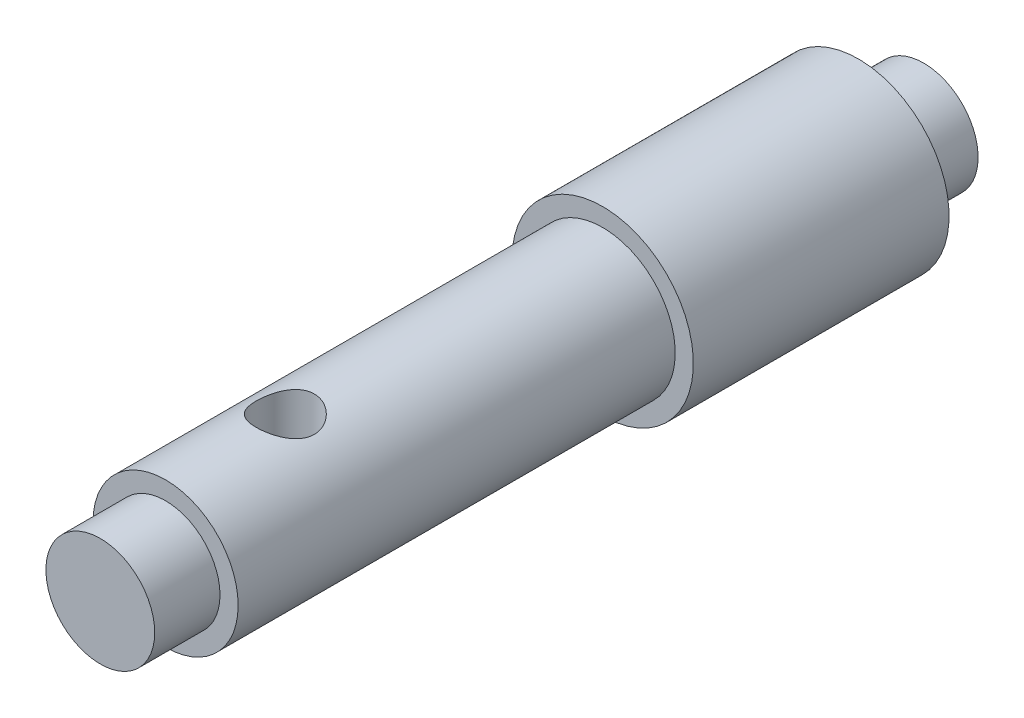
ISO-10303-21;
HEADER;
FILE_DESCRIPTION(('STEP AP214'),'2;1');
FILE_NAME('part.step','',(''),(''),'','','');
FILE_SCHEMA(('AUTOMOTIVE_DESIGN { 1 0 10303 214 1 1 1 1 }'));
ENDSEC;
DATA;
#1=APPLICATION_CONTEXT('core data for automotive mechanical design processes');
#2=APPLICATION_PROTOCOL_DEFINITION('international standard','automotive_design',2000,#1);
#3=PRODUCT_CONTEXT('',#1,'mechanical');
#4=PRODUCT('Part','Part','',(#3));
#5=PRODUCT_RELATED_PRODUCT_CATEGORY('part','',(#4));
#6=PRODUCT_DEFINITION_FORMATION('','',#4);
#7=PRODUCT_DEFINITION_CONTEXT('part definition',#1,'design');
#8=PRODUCT_DEFINITION('design','',#6,#7);
#9=PRODUCT_DEFINITION_SHAPE('','',#8);
#10=(LENGTH_UNIT() NAMED_UNIT(*) SI_UNIT(.MILLI.,.METRE.));
#11=(NAMED_UNIT(*) PLANE_ANGLE_UNIT() SI_UNIT($,.RADIAN.));
#12=(NAMED_UNIT(*) SI_UNIT($,.STERADIAN.) SOLID_ANGLE_UNIT());
#13=UNCERTAINTY_MEASURE_WITH_UNIT(LENGTH_MEASURE(1.E-05),#10,'distance_accuracy_value','');
#14=(GEOMETRIC_REPRESENTATION_CONTEXT(3) GLOBAL_UNCERTAINTY_ASSIGNED_CONTEXT((#13)) GLOBAL_UNIT_ASSIGNED_CONTEXT((#10,
#11,#12)) REPRESENTATION_CONTEXT('',''));
#15=CARTESIAN_POINT('',(0.,0.,0.));
#16=DIRECTION('',(0.,0.,1.));
#17=DIRECTION('',(1.,0.,0.));
#18=AXIS2_PLACEMENT_3D('',#15,#16,#17);
#19=CARTESIAN_POINT('',(0.,0.,45.4));
#20=DIRECTION('',(0.,0.,-1.));
#21=DIRECTION('',(-1.,0.,0.));
#22=AXIS2_PLACEMENT_3D('',#19,#20,#21);
#23=CYLINDRICAL_SURFACE('',#22,4.);
#24=CARTESIAN_POINT('',(0.,0.,41.8));
#25=DIRECTION('',(0.,0.,1.));
#26=DIRECTION('',(1.,0.,0.));
#27=AXIS2_PLACEMENT_3D('',#24,#25,#26);
#28=CIRCLE('',#27,4.);
#29=CARTESIAN_POINT('',(4.,0.,41.8));
#30=VERTEX_POINT('',#29);
#31=EDGE_CURVE('E101',#30,#30,#28,.T.);
#32=ORIENTED_EDGE('',*,*,#31,.F.);
#33=EDGE_LOOP('',(#32));
#34=FACE_BOUND('',#33,.T.);
#35=CARTESIAN_POINT('',(0.,4.,36.8));
#36=CARTESIAN_POINT('',(-0.0859944043543128,3.99999416981668,36.799992118541));
#37=CARTESIAN_POINT('',(-0.172138051272538,3.99719435445546,36.7930257983293));
#38=CARTESIAN_POINT('',(-0.341997184334316,3.98626762480513,36.765401837183));
#39=CARTESIAN_POINT('',(-0.425705422048998,3.97812622959102,36.7447069767311));
#40=CARTESIAN_POINT('',(-0.587963138181921,3.95739367370495,36.6904991375529));
#41=CARTESIAN_POINT('',(-0.666528529293564,3.94481709091258,36.6570281230266));
#42=CARTESIAN_POINT('',(-0.81685757626269,3.91645288636863,36.5783846613388));
#43=CARTESIAN_POINT('',(-0.888623581400791,3.90066637966445,36.5332162760648));
#44=CARTESIAN_POINT('',(-1.02680080605631,3.86664708936335,36.4302116011512));
#45=CARTESIAN_POINT('',(-1.09284981804017,3.84833837543352,36.3719146750078));
#46=CARTESIAN_POINT('',(-1.21454000382777,3.81168461524956,36.2452799972186));
#47=CARTESIAN_POINT('',(-1.27017608570682,3.79333955563034,36.1769373622306));
#48=CARTESIAN_POINT('',(-1.3718996538343,3.75778233437709,36.0284575438062));
#49=CARTESIAN_POINT('',(-1.41745198495637,3.74065692771961,35.9479308111814));
#50=CARTESIAN_POINT('',(-1.49420377522971,3.71066917749434,35.779570881264));
#51=CARTESIAN_POINT('',(-1.52541005142866,3.69780480995341,35.6917411777213));
#52=CARTESIAN_POINT('',(-1.57111905871669,3.67861086128655,35.5154301331263));
#53=CARTESIAN_POINT('',(-1.58631517264451,3.67201136284484,35.427159011539));
#54=CARTESIAN_POINT('',(-1.60173836931201,3.66531203239315,35.2490920013542));
#55=CARTESIAN_POINT('',(-1.60197281305057,3.66520900418215,35.1592968843));
#56=CARTESIAN_POINT('',(-1.58799149400363,3.67128400223996,34.9873946628336));
#57=CARTESIAN_POINT('',(-1.5747802514441,3.6770254003076,34.9051874284728));
#58=CARTESIAN_POINT('',(-1.53595750423825,3.69340950086269,34.7442723551946));
#59=CARTESIAN_POINT('',(-1.5103438358437,3.70405305857339,34.6655651295118));
#60=CARTESIAN_POINT('',(-1.44695578604085,3.72927588070824,34.5119857310432));
#61=CARTESIAN_POINT('',(-1.40894388985225,3.7439310342463,34.4372246087562));
#62=CARTESIAN_POINT('',(-1.32200516858576,3.77550493111912,34.2948673469107));
#63=CARTESIAN_POINT('',(-1.27307424408066,3.79242452365479,34.2272739124777));
#64=CARTESIAN_POINT('',(-1.16124047956353,3.82821389393817,34.0956722169584));
#65=CARTESIAN_POINT('',(-1.09754997037649,3.84713331980922,34.0323450164432));
#66=CARTESIAN_POINT('',(-0.960251541944142,3.88367859966626,33.9170524175984));
#67=CARTESIAN_POINT('',(-0.886641652267536,3.9013041955626,33.8650892820718));
#68=CARTESIAN_POINT('',(-0.729662122084663,3.93371745011639,33.7731060420673));
#69=CARTESIAN_POINT('',(-0.646128393077169,3.94844216076332,33.7333421750424));
#70=CARTESIAN_POINT('',(-0.472819012386293,3.97291862663007,33.6686657111376));
#71=CARTESIAN_POINT('',(-0.383046557479727,3.98267290769906,33.6437455699541));
#72=CARTESIAN_POINT('',(-0.205516710086246,3.99564911605528,33.6108413636642));
#73=CARTESIAN_POINT('',(-0.117954635188418,3.99922356666811,33.6019420365972));
#74=CARTESIAN_POINT('',(0.0574762478462628,4.00054782808505,33.5986295195771));
#75=CARTESIAN_POINT('',(0.145344970579148,3.99829914865833,33.604212574762));
#76=CARTESIAN_POINT('',(0.314746191297599,3.98846053651002,33.6290334020416));
#77=CARTESIAN_POINT('',(0.396385993420389,3.98111513076419,33.6476463842808));
#78=CARTESIAN_POINT('',(0.555308342448633,3.962075531244,33.6971485666479));
#79=CARTESIAN_POINT('',(0.632590328179883,3.95038077885224,33.7280393437349));
#80=CARTESIAN_POINT('',(0.783263028653369,3.92333275816649,33.802227951744));
#81=CARTESIAN_POINT('',(0.856462418204332,3.90787852783843,33.8458763776345));
#82=CARTESIAN_POINT('',(0.994754872997252,3.8749869179642,33.9439522591245));
#83=CARTESIAN_POINT('',(1.05984467260891,3.85754874488216,33.9983840343381));
#84=CARTESIAN_POINT('',(1.18457843442306,3.82116094110489,34.1206960103597));
#85=CARTESIAN_POINT('',(1.24357914704486,3.80218753140041,34.189226833205));
#86=CARTESIAN_POINT('',(1.34940095793097,3.76593338333706,34.3355520664075));
#87=CARTESIAN_POINT('',(1.39622004907001,3.74865292421208,34.413348000272));
#88=CARTESIAN_POINT('',(1.4766460015453,3.71771439926167,34.5771693556753));
#89=CARTESIAN_POINT('',(1.51012047562756,3.7040930470783,34.6632671993699));
#90=CARTESIAN_POINT('',(1.56183697576424,3.68258938782345,34.8405869213721));
#91=CARTESIAN_POINT('',(1.58009024421545,3.67470284556799,34.9318049646499));
#92=CARTESIAN_POINT('',(1.59977249382272,3.66617407439941,35.1097023214196));
#93=CARTESIAN_POINT('',(1.60231766584229,3.66505136806537,35.1962358716747));
#94=CARTESIAN_POINT('',(1.59344252742202,3.66891868826478,35.3684358861706));
#95=CARTESIAN_POINT('',(1.58202399033102,3.67390793859835,35.4541024591221));
#96=CARTESIAN_POINT('',(1.54645709292292,3.68901319263217,35.618665751884));
#97=CARTESIAN_POINT('',(1.52282999485678,3.69891865461959,35.6976962195464));
#98=CARTESIAN_POINT('',(1.46400435879281,3.72259200986157,35.8507029036908));
#99=CARTESIAN_POINT('',(1.42880262511505,3.73636096964805,35.9246777175199));
#100=CARTESIAN_POINT('',(1.34549821020778,3.76718887683593,36.0700876954166));
#101=CARTESIAN_POINT('',(1.29677226812759,3.78439105850594,36.1411349361044));
#102=CARTESIAN_POINT('',(1.18871369541719,3.8197104349779,36.274394653763));
#103=CARTESIAN_POINT('',(1.12937786785449,3.83782790438725,36.3366044577027));
#104=CARTESIAN_POINT('',(0.997204405017967,3.87434853669915,36.4545622826109));
#105=CARTESIAN_POINT('',(0.923740800916907,3.89269406369748,36.5096298455185));
#106=CARTESIAN_POINT('',(0.767920256228619,3.92640325370973,36.6066696340973));
#107=CARTESIAN_POINT('',(0.685559203637785,3.94176552874325,36.648635769722));
#108=CARTESIAN_POINT('',(0.515790449996157,3.96751771852689,36.7172977721522));
#109=CARTESIAN_POINT('',(0.428505294575751,3.97799490444022,36.7442634588483));
#110=CARTESIAN_POINT('',(0.250301237024972,3.99315444967493,36.7829112967634));
#111=CARTESIAN_POINT('',(0.159394820687126,3.9978551959651,36.7946419493951));
#112=CARTESIAN_POINT('',(0.0455298383127422,3.99980719603309,36.7995163047826));
#113=CARTESIAN_POINT('',(0.0227701509926059,4.00000154375341,36.8000020869034));
#114=CARTESIAN_POINT('',(0.,4.,36.8));
#115=B_SPLINE_CURVE_WITH_KNOTS('',3,(#35,#36,#37,#38,#39,#40,#41,#42,#43,#44,#45,#46,#47,#48,
#49,#50,#51,#52,#53,#54,#55,#56,#57,#58,#59,#60,#61,#62,#63,#64,#65,#66,#67,#68,#69,#70,#71,#72,
#73,#74,#75,#76,#77,#78,#79,#80,#81,#82,#83,#84,#85,#86,#87,#88,#89,#90,#91,#92,#93,#94,#95,#96,
#97,#98,#99,#100,#101,#102,#103,#104,#105,#106,#107,#108,#109,#110,#111,#112,#113,#114),
.UNSPECIFIED.,.T.,.F.,(4,2,2,2,2,2,2,2,2,2,2,2,2,2,2,2,2,2,2,2,2,2,2,2,2,2,2,2,2,2,2,2,2,2,2,2,
2,2,2,4),(0.,0.257922390314456,0.516546908806346,0.774329165977263,1.03202202854387,
1.30077905360318,1.56966715947529,1.85052207055373,2.13124338494615,2.39923284247063,
2.6670904507239,2.91630662721096,3.16556629804836,3.41991301039052,3.67435537550546,
3.94846679349245,4.22263274271785,4.50221530530244,4.78165564891031,5.04455347622405,
5.30738314856064,5.55840364451491,5.80945639195036,6.06818810718609,6.32702367599174,
6.6029477969953,6.87891735234997,7.1575603611266,7.43599738116745,7.69439738714196,
7.95276458050434,8.20091454839012,8.44913308644127,8.71156374445351,8.97407361078712,
9.25360338827067,9.53326290912424,9.80771440810653,10.0812900192347,10.1495843671743),.UNSPECIFIED.);
#116=CARTESIAN_POINT('',(0.,4.,36.8));
#117=VERTEX_POINT('',#116);
#118=EDGE_CURVE('E44',#117,#117,#115,.T.);
#119=ORIENTED_EDGE('',*,*,#118,.T.);
#120=EDGE_LOOP('',(#119));
#121=FACE_BOUND('',#120,.T.);
#122=CARTESIAN_POINT('',(0.,-4.,36.8));
#123=CARTESIAN_POINT('',(0.0859944043543171,-3.99999416981668,36.799992118541));
#124=CARTESIAN_POINT('',(0.172138051272542,-3.99719435445546,36.7930257983293));
#125=CARTESIAN_POINT('',(0.34199718433432,-3.98626762480513,36.765401837183));
#126=CARTESIAN_POINT('',(0.425705422049001,-3.97812622959102,36.7447069767311));
#127=CARTESIAN_POINT('',(0.587963138181925,-3.95739367370495,36.6904991375529));
#128=CARTESIAN_POINT('',(0.666528529293569,-3.94481709091258,36.6570281230266));
#129=CARTESIAN_POINT('',(0.816857576262696,-3.91645288636862,36.5783846613388));
#130=CARTESIAN_POINT('',(0.888623581400795,-3.90066637966445,36.5332162760648));
#131=CARTESIAN_POINT('',(1.02680080605632,-3.86664708936335,36.4302116011512));
#132=CARTESIAN_POINT('',(1.09284981804017,-3.84833837543352,36.3719146750078));
#133=CARTESIAN_POINT('',(1.21454000382778,-3.81168461524956,36.2452799972186));
#134=CARTESIAN_POINT('',(1.27017608570683,-3.79333955563034,36.1769373622306));
#135=CARTESIAN_POINT('',(1.3718996538343,-3.75778233437709,36.0284575438062));
#136=CARTESIAN_POINT('',(1.41745198495638,-3.74065692771961,35.9479308111814));
#137=CARTESIAN_POINT('',(1.49420377522972,-3.71066917749434,35.779570881264));
#138=CARTESIAN_POINT('',(1.52541005142867,-3.69780480995341,35.6917411777213));
#139=CARTESIAN_POINT('',(1.57111905871669,-3.67861086128655,35.5154301331263));
#140=CARTESIAN_POINT('',(1.58631517264452,-3.67201136284484,35.427159011539));
#141=CARTESIAN_POINT('',(1.60173836931202,-3.66531203239315,35.2490920013542));
#142=CARTESIAN_POINT('',(1.60197281305058,-3.66520900418215,35.1592968843));
#143=CARTESIAN_POINT('',(1.58799149400364,-3.67128400223995,34.9873946628336));
#144=CARTESIAN_POINT('',(1.57478025144411,-3.6770254003076,34.9051874284728));
#145=CARTESIAN_POINT('',(1.53595750423826,-3.69340950086269,34.7442723551946));
#146=CARTESIAN_POINT('',(1.51034383584371,-3.70405305857338,34.6655651295118));
#147=CARTESIAN_POINT('',(1.44695578604086,-3.72927588070824,34.5119857310432));
#148=CARTESIAN_POINT('',(1.40894388985225,-3.7439310342463,34.4372246087563));
#149=CARTESIAN_POINT('',(1.32200516858577,-3.77550493111912,34.2948673469107));
#150=CARTESIAN_POINT('',(1.27307424408068,-3.79242452365479,34.2272739124778));
#151=CARTESIAN_POINT('',(1.16124047956355,-3.82821389393817,34.0956722169584));
#152=CARTESIAN_POINT('',(1.09754997037651,-3.84713331980921,34.0323450164432));
#153=CARTESIAN_POINT('',(0.960251541944154,-3.88367859966626,33.9170524175984));
#154=CARTESIAN_POINT('',(0.886641652267547,-3.9013041955626,33.8650892820718));
#155=CARTESIAN_POINT('',(0.729662122084675,-3.93371745011639,33.7731060420673));
#156=CARTESIAN_POINT('',(0.646128393077182,-3.94844216076332,33.7333421750424));
#157=CARTESIAN_POINT('',(0.472819012386308,-3.97291862663007,33.6686657111376));
#158=CARTESIAN_POINT('',(0.383046557479743,-3.98267290769906,33.6437455699541));
#159=CARTESIAN_POINT('',(0.205516710086262,-3.99564911605528,33.6108413636642));
#160=CARTESIAN_POINT('',(0.117954635188433,-3.99922356666811,33.6019420365972));
#161=CARTESIAN_POINT('',(-0.0574762478462483,-4.00054782808505,33.5986295195771));
#162=CARTESIAN_POINT('',(-0.145344970579134,-3.99829914865833,33.604212574762));
#163=CARTESIAN_POINT('',(-0.314746191297585,-3.98846053651002,33.6290334020416));
#164=CARTESIAN_POINT('',(-0.396385993420374,-3.98111513076419,33.6476463842808));
#165=CARTESIAN_POINT('',(-0.555308342448619,-3.962075531244,33.6971485666479));
#166=CARTESIAN_POINT('',(-0.632590328179871,-3.95038077885224,33.7280393437349));
#167=CARTESIAN_POINT('',(-0.783263028653356,-3.92333275816649,33.802227951744));
#168=CARTESIAN_POINT('',(-0.856462418204317,-3.90787852783843,33.8458763776345));
#169=CARTESIAN_POINT('',(-0.994754872997236,-3.8749869179642,33.9439522591245));
#170=CARTESIAN_POINT('',(-1.05984467260889,-3.85754874488217,33.9983840343381));
#171=CARTESIAN_POINT('',(-1.18457843442305,-3.8211609411049,34.1206960103597));
#172=CARTESIAN_POINT('',(-1.24357914704484,-3.80218753140042,34.189226833205));
#173=CARTESIAN_POINT('',(-1.34940095793096,-3.76593338333706,34.3355520664075));
#174=CARTESIAN_POINT('',(-1.39622004907,-3.74865292421209,34.413348000272));
#175=CARTESIAN_POINT('',(-1.47664600154529,-3.71771439926167,34.5771693556753));
#176=CARTESIAN_POINT('',(-1.51012047562755,-3.70409304707831,34.6632671993698));
#177=CARTESIAN_POINT('',(-1.56183697576423,-3.68258938782346,34.8405869213721));
#178=CARTESIAN_POINT('',(-1.58009024421544,-3.67470284556799,34.9318049646499));
#179=CARTESIAN_POINT('',(-1.59977249382271,-3.66617407439941,35.1097023214196));
#180=CARTESIAN_POINT('',(-1.60231766584229,-3.66505136806538,35.1962358716747));
#181=CARTESIAN_POINT('',(-1.59344252742201,-3.66891868826479,35.3684358861706));
#182=CARTESIAN_POINT('',(-1.58202399033102,-3.67390793859835,35.4541024591221));
#183=CARTESIAN_POINT('',(-1.54645709292291,-3.68901319263217,35.618665751884));
#184=CARTESIAN_POINT('',(-1.52282999485677,-3.6989186546196,35.6976962195464));
#185=CARTESIAN_POINT('',(-1.4640043587928,-3.72259200986158,35.8507029036908));
#186=CARTESIAN_POINT('',(-1.42880262511504,-3.73636096964806,35.9246777175199));
#187=CARTESIAN_POINT('',(-1.34549821020777,-3.76718887683593,36.0700876954166));
#188=CARTESIAN_POINT('',(-1.29677226812758,-3.78439105850594,36.1411349361044));
#189=CARTESIAN_POINT('',(-1.18871369541719,-3.8197104349779,36.274394653763));
#190=CARTESIAN_POINT('',(-1.12937786785449,-3.83782790438725,36.3366044577026));
#191=CARTESIAN_POINT('',(-0.997204405017967,-3.87434853669915,36.4545622826109));
#192=CARTESIAN_POINT('',(-0.923740800916908,-3.89269406369748,36.5096298455184));
#193=CARTESIAN_POINT('',(-0.767920256228621,-3.92640325370973,36.6066696340973));
#194=CARTESIAN_POINT('',(-0.685559203637788,-3.94176552874325,36.648635769722));
#195=CARTESIAN_POINT('',(-0.515790449996161,-3.96751771852689,36.7172977721522));
#196=CARTESIAN_POINT('',(-0.428505294575754,-3.97799490444022,36.7442634588483));
#197=CARTESIAN_POINT('',(-0.250301237024973,-3.99315444967493,36.7829112967634));
#198=CARTESIAN_POINT('',(-0.159394820687126,-3.9978551959651,36.7946419493951));
#199=CARTESIAN_POINT('',(-0.0455298383127392,-3.99980719603309,36.7995163047826));
#200=CARTESIAN_POINT('',(-0.0227701509926023,-4.00000154375341,36.8000020869034));
#201=CARTESIAN_POINT('',(0.,-4.,36.8));
#202=B_SPLINE_CURVE_WITH_KNOTS('',3,(#122,#123,#124,#125,#126,#127,#128,#129,#130,#131,#132,
#133,#134,#135,#136,#137,#138,#139,#140,#141,#142,#143,#144,#145,#146,#147,#148,#149,#150,#151,
#152,#153,#154,#155,#156,#157,#158,#159,#160,#161,#162,#163,#164,#165,#166,#167,#168,#169,#170,
#171,#172,#173,#174,#175,#176,#177,#178,#179,#180,#181,#182,#183,#184,#185,#186,#187,#188,#189,
#190,#191,#192,#193,#194,#195,#196,#197,#198,#199,#200,#201),.UNSPECIFIED.,.T.,.F.,(4,2,2,2,2,2,
2,2,2,2,2,2,2,2,2,2,2,2,2,2,2,2,2,2,2,2,2,2,2,2,2,2,2,2,2,2,2,2,2,4),(0.,0.257922390314456,
0.516546908806346,0.774329165977261,1.03202202854387,1.30077905360317,1.56966715947529,
1.85052207055373,2.13124338494614,2.39923284247062,2.6670904507239,2.91630662721096,
3.16556629804837,3.41991301039052,3.67435537550546,3.94846679349245,4.22263274271785,
4.50221530530244,4.78165564891031,5.04455347622405,5.30738314856065,5.55840364451491,
5.80945639195036,6.06818810718609,6.32702367599174,6.60294779699529,6.87891735234997,
7.15756036112659,7.43599738116745,7.69439738714196,7.95276458050434,8.20091454839013,
8.44913308644128,8.71156374445352,8.97407361078712,9.25360338827066,9.53326290912423,
9.80771440810652,10.0812900192347,10.1495843671743),.UNSPECIFIED.);
#203=CARTESIAN_POINT('',(0.,-4.,36.8));
#204=VERTEX_POINT('',#203);
#205=EDGE_CURVE('E40',#204,#204,#202,.T.);
#206=ORIENTED_EDGE('',*,*,#205,.T.);
#207=EDGE_LOOP('',(#206));
#208=FACE_BOUND('',#207,.T.);
#209=CARTESIAN_POINT('',(0.,0.,17.7));
#210=DIRECTION('',(0.,0.,-1.));
#211=DIRECTION('',(-1.,0.,0.));
#212=AXIS2_PLACEMENT_3D('',#209,#210,#211);
#213=CIRCLE('',#212,4.);
#214=CARTESIAN_POINT('',(-4.,0.,17.7));
#215=VERTEX_POINT('',#214);
#216=EDGE_CURVE('E10',#215,#215,#213,.T.);
#217=ORIENTED_EDGE('',*,*,#216,.F.);
#218=EDGE_LOOP('',(#217));
#219=FACE_BOUND('',#218,.T.);
#220=ADVANCED_FACE('F33',(#34,#121,#208,#219),#23,.T.);
#221=CARTESIAN_POINT('',(0.,0.,41.8));
#222=DIRECTION('',(0.,0.,1.));
#223=DIRECTION('',(1.,0.,0.));
#224=AXIS2_PLACEMENT_3D('',#221,#222,#223);
#225=PLANE('',#224);
#226=CARTESIAN_POINT('',(0.,0.,41.8));
#227=DIRECTION('',(0.,0.,1.));
#228=DIRECTION('',(1.,0.,0.));
#229=AXIS2_PLACEMENT_3D('',#226,#227,#228);
#230=CIRCLE('',#229,3.);
#231=CARTESIAN_POINT('',(3.,0.,41.8));
#232=VERTEX_POINT('',#231);
#233=EDGE_CURVE('E107',#232,#232,#230,.T.);
#234=ORIENTED_EDGE('',*,*,#233,.F.);
#235=EDGE_LOOP('',(#234));
#236=FACE_BOUND('',#235,.T.);
#237=ORIENTED_EDGE('',*,*,#31,.T.);
#238=EDGE_LOOP('',(#237));
#239=FACE_BOUND('',#238,.T.);
#240=ADVANCED_FACE('F71',(#236,#239),#225,.T.);
#241=CARTESIAN_POINT('',(0.,0.,41.8));
#242=DIRECTION('',(0.,0.,1.));
#243=DIRECTION('',(1.,0.,0.));
#244=AXIS2_PLACEMENT_3D('',#241,#242,#243);
#245=CYLINDRICAL_SURFACE('',#244,3.);
#246=ORIENTED_EDGE('',*,*,#233,.T.);
#247=EDGE_LOOP('',(#246));
#248=FACE_BOUND('',#247,.T.);
#249=CARTESIAN_POINT('',(0.,0.,45.4));
#250=DIRECTION('',(0.,0.,1.));
#251=DIRECTION('',(1.,0.,0.));
#252=AXIS2_PLACEMENT_3D('',#249,#250,#251);
#253=CIRCLE('',#252,3.);
#254=CARTESIAN_POINT('',(3.,0.,45.4));
#255=VERTEX_POINT('',#254);
#256=EDGE_CURVE('E110',#255,#255,#253,.T.);
#257=ORIENTED_EDGE('',*,*,#256,.F.);
#258=EDGE_LOOP('',(#257));
#259=FACE_BOUND('',#258,.T.);
#260=ADVANCED_FACE('F67',(#248,#259),#245,.T.);
#261=CARTESIAN_POINT('',(0.,0.,45.4));
#262=DIRECTION('',(0.,0.,1.));
#263=DIRECTION('',(1.,0.,0.));
#264=AXIS2_PLACEMENT_3D('',#261,#262,#263);
#265=PLANE('',#264);
#266=ORIENTED_EDGE('',*,*,#256,.T.);
#267=EDGE_LOOP('',(#266));
#268=FACE_BOUND('',#267,.T.);
#269=ADVANCED_FACE('F64',(#268),#265,.T.);
#270=CARTESIAN_POINT('',(0.,-4.,35.2));
#271=DIRECTION('',(0.,1.,0.));
#272=DIRECTION('',(0.,0.,1.));
#273=AXIS2_PLACEMENT_3D('',#270,#271,#272);
#274=CYLINDRICAL_SURFACE('',#273,1.6);
#275=ORIENTED_EDGE('',*,*,#118,.F.);
#276=EDGE_LOOP('',(#275));
#277=FACE_BOUND('',#276,.T.);
#278=ORIENTED_EDGE('',*,*,#205,.F.);
#279=EDGE_LOOP('',(#278));
#280=FACE_BOUND('',#279,.T.);
#281=ADVANCED_FACE('F58',(#277,#280),#274,.F.);
#282=CARTESIAN_POINT('',(0.,0.,17.7));
#283=DIRECTION('',(0.,0.,-1.));
#284=DIRECTION('',(-1.,0.,0.));
#285=AXIS2_PLACEMENT_3D('',#282,#283,#284);
#286=CYLINDRICAL_SURFACE('',#285,5.);
#287=CARTESIAN_POINT('',(0.,0.,17.7));
#288=DIRECTION('',(0.,0.,-1.));
#289=DIRECTION('',(-1.,0.,0.));
#290=AXIS2_PLACEMENT_3D('',#287,#288,#289);
#291=CIRCLE('',#290,5.);
#292=CARTESIAN_POINT('',(-5.,0.,17.7));
#293=VERTEX_POINT('',#292);
#294=EDGE_CURVE('E122',#293,#293,#291,.T.);
#295=CARTESIAN_POINT('',(0.,0.,3.6));
#296=DIRECTION('',(0.,0.,-1.));
#297=DIRECTION('',(-1.,0.,0.));
#298=AXIS2_PLACEMENT_3D('',#295,#296,#297);
#299=CIRCLE('',#298,5.);
#300=CARTESIAN_POINT('',(-5.,0.,3.6));
#301=VERTEX_POINT('',#300);
#302=EDGE_CURVE('E120',#301,#301,#299,.T.);
#303=CARTESIAN_POINT('',(-5.,0.,17.7));
#304=CARTESIAN_POINT('',(-5.,0.,17.553125));
#305=CARTESIAN_POINT('',(-5.,0.,17.40625));
#306=CARTESIAN_POINT('',(-5.,0.,17.1125));
#307=CARTESIAN_POINT('',(-5.,0.,16.965625));
#308=CARTESIAN_POINT('',(-5.,0.,16.671875));
#309=CARTESIAN_POINT('',(-5.,0.,16.525));
#310=CARTESIAN_POINT('',(-5.,0.,16.23125));
#311=CARTESIAN_POINT('',(-5.,0.,16.084375));
#312=CARTESIAN_POINT('',(-5.,0.,15.790625));
#313=CARTESIAN_POINT('',(-5.,0.,15.64375));
#314=CARTESIAN_POINT('',(-5.,0.,15.35));
#315=CARTESIAN_POINT('',(-5.,0.,15.203125));
#316=CARTESIAN_POINT('',(-5.,0.,14.909375));
#317=CARTESIAN_POINT('',(-5.,0.,14.7625));
#318=CARTESIAN_POINT('',(-5.,0.,14.46875));
#319=CARTESIAN_POINT('',(-5.,0.,14.321875));
#320=CARTESIAN_POINT('',(-5.,0.,14.028125));
#321=CARTESIAN_POINT('',(-5.,0.,13.88125));
#322=CARTESIAN_POINT('',(-5.,0.,13.5875));
#323=CARTESIAN_POINT('',(-5.,0.,13.440625));
#324=CARTESIAN_POINT('',(-5.,0.,13.146875));
#325=CARTESIAN_POINT('',(-5.,0.,13.));
#326=CARTESIAN_POINT('',(-5.,0.,12.70625));
#327=CARTESIAN_POINT('',(-5.,0.,12.559375));
#328=CARTESIAN_POINT('',(-5.,0.,12.265625));
#329=CARTESIAN_POINT('',(-5.,0.,12.11875));
#330=CARTESIAN_POINT('',(-5.,0.,11.825));
#331=CARTESIAN_POINT('',(-5.,0.,11.678125));
#332=CARTESIAN_POINT('',(-5.,0.,11.384375));
#333=CARTESIAN_POINT('',(-5.,0.,11.2375));
#334=CARTESIAN_POINT('',(-5.,0.,10.94375));
#335=CARTESIAN_POINT('',(-5.,0.,10.796875));
#336=CARTESIAN_POINT('',(-5.,0.,10.503125));
#337=CARTESIAN_POINT('',(-5.,0.,10.35625));
#338=CARTESIAN_POINT('',(-5.,0.,10.0625));
#339=CARTESIAN_POINT('',(-5.,0.,9.915625));
#340=CARTESIAN_POINT('',(-5.,0.,9.621875));
#341=CARTESIAN_POINT('',(-5.,0.,9.475));
#342=CARTESIAN_POINT('',(-5.,0.,9.18125));
#343=CARTESIAN_POINT('',(-5.,0.,9.034375));
#344=CARTESIAN_POINT('',(-5.,0.,8.740625));
#345=CARTESIAN_POINT('',(-5.,0.,8.59375));
#346=CARTESIAN_POINT('',(-5.,0.,8.3));
#347=CARTESIAN_POINT('',(-5.,0.,8.153125));
#348=CARTESIAN_POINT('',(-5.,0.,7.859375));
#349=CARTESIAN_POINT('',(-5.,0.,7.7125));
#350=CARTESIAN_POINT('',(-5.,0.,7.41875));
#351=CARTESIAN_POINT('',(-5.,0.,7.271875));
#352=CARTESIAN_POINT('',(-5.,0.,6.978125));
#353=CARTESIAN_POINT('',(-5.,0.,6.83125));
#354=CARTESIAN_POINT('',(-5.,0.,6.5375));
#355=CARTESIAN_POINT('',(-5.,0.,6.390625));
#356=CARTESIAN_POINT('',(-5.,0.,6.096875));
#357=CARTESIAN_POINT('',(-5.,0.,5.95));
#358=CARTESIAN_POINT('',(-5.,0.,5.65625));
#359=CARTESIAN_POINT('',(-5.,0.,5.509375));
#360=CARTESIAN_POINT('',(-5.,0.,5.215625));
#361=CARTESIAN_POINT('',(-5.,0.,5.06875));
#362=CARTESIAN_POINT('',(-5.,0.,4.775));
#363=CARTESIAN_POINT('',(-5.,0.,4.628125));
#364=CARTESIAN_POINT('',(-5.,0.,4.334375));
#365=CARTESIAN_POINT('',(-5.,0.,4.1875));
#366=CARTESIAN_POINT('',(-5.,0.,3.89375));
#367=CARTESIAN_POINT('',(-5.,0.,3.746875));
#368=CARTESIAN_POINT('',(-5.,0.,3.6));
#369=B_SPLINE_CURVE_WITH_KNOTS('',3,(#303,#304,#305,#306,#307,#308,#309,#310,#311,#312,#313,
#314,#315,#316,#317,#318,#319,#320,#321,#322,#323,#324,#325,#326,#327,#328,#329,#330,#331,#332,
#333,#334,#335,#336,#337,#338,#339,#340,#341,#342,#343,#344,#345,#346,#347,#348,#349,#350,#351,
#352,#353,#354,#355,#356,#357,#358,#359,#360,#361,#362,#363,#364,#365,#366,#367,#368),
.UNSPECIFIED.,.F.,.F.,(4,2,2,2,2,2,2,2,2,2,2,2,2,2,2,2,2,2,2,2,2,2,2,2,2,2,2,2,2,2,2,2,4),(0.,
0.440625,0.88125,1.321875,1.7625,2.203125,2.64375,3.084375,3.525,3.965625,4.40625,4.846875,
5.2875,5.728125,6.16875,6.609375,7.05,7.490625,7.93125,8.371875,8.8125,9.253125,9.69375,
10.134375,10.575,11.015625,11.45625,11.896875,12.3375,12.778125,13.21875,13.659375,14.1),.UNSPECIFIED.);
#370=EDGE_CURVE('BSEAM63',#293,#301,#369,.T.);
#371=ORIENTED_EDGE('',*,*,#294,.T.);
#372=ORIENTED_EDGE('',*,*,#302,.F.);
#373=ORIENTED_EDGE('',*,*,#370,.T.);
#374=ORIENTED_EDGE('',*,*,#370,.F.);
#375=EDGE_LOOP('',(#371,#373,#372,#374));
#376=FACE_BOUND('',#375,.T.);
#377=ADVANCED_FACE('F63',(#376),#286,.T.);
#378=CARTESIAN_POINT('',(0.,0.,17.7));
#379=DIRECTION('',(0.,0.,-1.));
#380=DIRECTION('',(-1.,0.,0.));
#381=AXIS2_PLACEMENT_3D('',#378,#379,#380);
#382=PLANE('',#381);
#383=ORIENTED_EDGE('',*,*,#216,.T.);
#384=EDGE_LOOP('',(#383));
#385=FACE_BOUND('',#384,.T.);
#386=ORIENTED_EDGE('',*,*,#294,.F.);
#387=EDGE_LOOP('',(#386));
#388=FACE_BOUND('',#387,.T.);
#389=ADVANCED_FACE('F88',(#385,#388),#382,.F.);
#390=CARTESIAN_POINT('',(0.,0.,0.));
#391=DIRECTION('',(0.,0.,1.));
#392=DIRECTION('',(1.,0.,0.));
#393=AXIS2_PLACEMENT_3D('',#390,#391,#392);
#394=PLANE('',#393);
#395=CARTESIAN_POINT('',(0.,0.,0.));
#396=DIRECTION('',(0.,0.,-1.));
#397=DIRECTION('',(-1.,0.,0.));
#398=AXIS2_PLACEMENT_3D('',#395,#396,#397);
#399=CIRCLE('',#398,3.);
#400=CARTESIAN_POINT('',(-3.,0.,0.));
#401=VERTEX_POINT('',#400);
#402=EDGE_CURVE('E106',#401,#401,#399,.T.);
#403=ORIENTED_EDGE('',*,*,#402,.T.);
#404=EDGE_LOOP('',(#403));
#405=FACE_BOUND('',#404,.T.);
#406=ADVANCED_FACE('F80',(#405),#394,.F.);
#407=CARTESIAN_POINT('',(0.,0.,3.6));
#408=DIRECTION('',(0.,0.,-1.));
#409=DIRECTION('',(-1.,0.,0.));
#410=AXIS2_PLACEMENT_3D('',#407,#408,#409);
#411=CYLINDRICAL_SURFACE('',#410,3.);
#412=CARTESIAN_POINT('',(0.,0.,3.6));
#413=DIRECTION('',(0.,0.,-1.));
#414=DIRECTION('',(-1.,0.,0.));
#415=AXIS2_PLACEMENT_3D('',#412,#413,#414);
#416=CIRCLE('',#415,3.);
#417=CARTESIAN_POINT('',(-3.,0.,3.6));
#418=VERTEX_POINT('',#417);
#419=EDGE_CURVE('E48',#418,#418,#416,.T.);
#420=ORIENTED_EDGE('',*,*,#419,.T.);
#421=EDGE_LOOP('',(#420));
#422=FACE_BOUND('',#421,.T.);
#423=ORIENTED_EDGE('',*,*,#402,.F.);
#424=EDGE_LOOP('',(#423));
#425=FACE_BOUND('',#424,.T.);
#426=ADVANCED_FACE('F76',(#422,#425),#411,.T.);
#427=CARTESIAN_POINT('',(0.,0.,3.6));
#428=DIRECTION('',(0.,0.,-1.));
#429=DIRECTION('',(-1.,0.,0.));
#430=AXIS2_PLACEMENT_3D('',#427,#428,#429);
#431=PLANE('',#430);
#432=ORIENTED_EDGE('',*,*,#419,.F.);
#433=EDGE_LOOP('',(#432));
#434=FACE_BOUND('',#433,.T.);
#435=ORIENTED_EDGE('',*,*,#302,.T.);
#436=EDGE_LOOP('',(#435));
#437=FACE_BOUND('',#436,.T.);
#438=ADVANCED_FACE('F79',(#434,#437),#431,.T.);
#439=CLOSED_SHELL('',(#220,#240,#260,#269,#281,#377,#389,#406,#426,#438));
#440=MANIFOLD_SOLID_BREP('B2',#439);
#441=ADVANCED_BREP_SHAPE_REPRESENTATION('',(#18,#440),#14);
#442=SHAPE_DEFINITION_REPRESENTATION(#9,#441);
ENDSEC;
END-ISO-10303-21;
